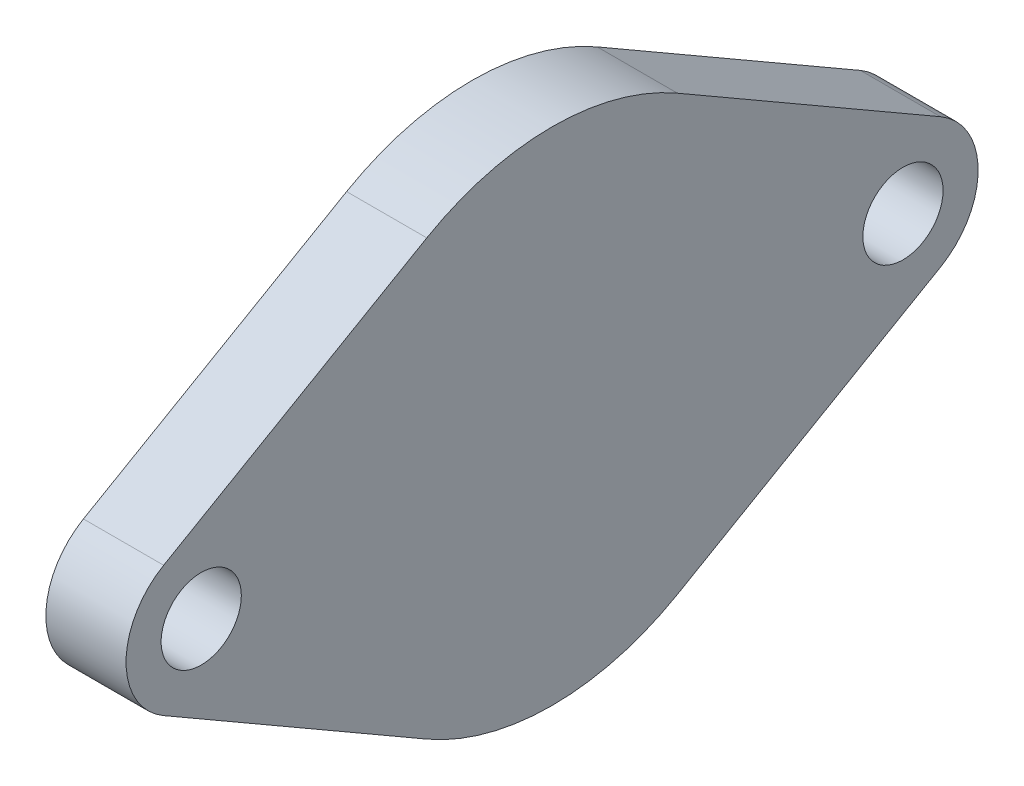
ISO-10303-21;
HEADER;
FILE_DESCRIPTION(('STEP AP214'),'2;1');
FILE_NAME('part.step','',(''),(''),'','','');
FILE_SCHEMA(('AUTOMOTIVE_DESIGN { 1 0 10303 214 1 1 1 1 }'));
ENDSEC;
DATA;
#1=APPLICATION_CONTEXT('core data for automotive mechanical design processes');
#2=APPLICATION_PROTOCOL_DEFINITION('international standard','automotive_design',2000,#1);
#3=PRODUCT_CONTEXT('',#1,'mechanical');
#4=PRODUCT('Part','Part','',(#3));
#5=PRODUCT_RELATED_PRODUCT_CATEGORY('part','',(#4));
#6=PRODUCT_DEFINITION_FORMATION('','',#4);
#7=PRODUCT_DEFINITION_CONTEXT('part definition',#1,'design');
#8=PRODUCT_DEFINITION('design','',#6,#7);
#9=PRODUCT_DEFINITION_SHAPE('','',#8);
#10=(LENGTH_UNIT() NAMED_UNIT(*) SI_UNIT(.MILLI.,.METRE.));
#11=(NAMED_UNIT(*) PLANE_ANGLE_UNIT() SI_UNIT($,.RADIAN.));
#12=(NAMED_UNIT(*) SI_UNIT($,.STERADIAN.) SOLID_ANGLE_UNIT());
#13=UNCERTAINTY_MEASURE_WITH_UNIT(LENGTH_MEASURE(1.E-05),#10,'distance_accuracy_value','');
#14=(GEOMETRIC_REPRESENTATION_CONTEXT(3) GLOBAL_UNCERTAINTY_ASSIGNED_CONTEXT((#13)) GLOBAL_UNIT_ASSIGNED_CONTEXT((#10,
#11,#12)) REPRESENTATION_CONTEXT('',''));
#15=CARTESIAN_POINT('',(0.,0.,0.));
#16=DIRECTION('',(0.,0.,1.));
#17=DIRECTION('',(1.,0.,0.));
#18=AXIS2_PLACEMENT_3D('',#15,#16,#17);
#19=CARTESIAN_POINT('',(4.,0.,0.));
#20=DIRECTION('',(1.,0.,0.));
#21=DIRECTION('',(0.,0.,-1.));
#22=AXIS2_PLACEMENT_3D('',#19,#20,#21);
#23=PLANE('',#22);
#24=DIRECTION('',(0.,0.500000000000001,-0.866025403784438));
#25=VECTOR('',#24,1.);
#26=CARTESIAN_POINT('',(4.,-21.650635094611,-12.5));
#27=LINE('',#26,#25);
#28=CARTESIAN_POINT('',(4.,-21.650635094611,-12.5));
#29=VERTEX_POINT('',#28);
#30=CARTESIAN_POINT('',(4.,-6.49519052838328,-38.75));
#31=VERTEX_POINT('',#30);
#32=EDGE_CURVE('E154',#29,#31,#27,.T.);
#33=ORIENTED_EDGE('',*,*,#32,.T.);
#34=CARTESIAN_POINT('',(4.,0.,-35.));
#35=DIRECTION('',(1.,0.,0.));
#36=DIRECTION('',(0.,0.,-1.));
#37=AXIS2_PLACEMENT_3D('',#34,#35,#36);
#38=CIRCLE('',#37,7.5);
#39=CARTESIAN_POINT('',(4.,6.4951905283833,-38.75));
#40=VERTEX_POINT('',#39);
#41=EDGE_CURVE('E162',#31,#40,#38,.T.);
#42=ORIENTED_EDGE('',*,*,#41,.T.);
#43=DIRECTION('',(0.,-0.5,-0.866025403784439));
#44=VECTOR('',#43,1.);
#45=CARTESIAN_POINT('',(4.,21.650635094611,-12.5));
#46=LINE('',#45,#44);
#47=CARTESIAN_POINT('',(4.,21.650635094611,-12.5));
#48=VERTEX_POINT('',#47);
#49=EDGE_CURVE('E168',#48,#40,#46,.T.);
#50=ORIENTED_EDGE('',*,*,#49,.F.);
#51=CARTESIAN_POINT('',(4.,0.,0.));
#52=DIRECTION('',(1.,0.,0.));
#53=DIRECTION('',(0.,0.,-1.));
#54=AXIS2_PLACEMENT_3D('',#51,#52,#53);
#55=CIRCLE('',#54,25.);
#56=CARTESIAN_POINT('',(4.,21.650635094611,12.5));
#57=VERTEX_POINT('',#56);
#58=EDGE_CURVE('E177',#48,#57,#55,.T.);
#59=ORIENTED_EDGE('',*,*,#58,.T.);
#60=DIRECTION('',(0.,0.5,-0.866025403784439));
#61=VECTOR('',#60,1.);
#62=CARTESIAN_POINT('',(4.,21.650635094611,12.5));
#63=LINE('',#62,#61);
#64=CARTESIAN_POINT('',(4.,6.49519052838329,38.75));
#65=VERTEX_POINT('',#64);
#66=EDGE_CURVE('E180',#65,#57,#63,.T.);
#67=ORIENTED_EDGE('',*,*,#66,.F.);
#68=CARTESIAN_POINT('',(4.,0.,35.));
#69=DIRECTION('',(1.,0.,0.));
#70=DIRECTION('',(0.,0.,-1.));
#71=AXIS2_PLACEMENT_3D('',#68,#69,#70);
#72=CIRCLE('',#71,7.5);
#73=CARTESIAN_POINT('',(4.,-6.49519052838329,38.75));
#74=VERTEX_POINT('',#73);
#75=EDGE_CURVE('E183',#65,#74,#72,.T.);
#76=ORIENTED_EDGE('',*,*,#75,.T.);
#77=DIRECTION('',(0.,0.5,0.866025403784439));
#78=VECTOR('',#77,1.);
#79=CARTESIAN_POINT('',(4.,-21.650635094611,12.5));
#80=LINE('',#79,#78);
#81=CARTESIAN_POINT('',(4.,-21.650635094611,12.5));
#82=VERTEX_POINT('',#81);
#83=EDGE_CURVE('E186',#82,#74,#80,.T.);
#84=ORIENTED_EDGE('',*,*,#83,.F.);
#85=CARTESIAN_POINT('',(4.,0.,0.));
#86=DIRECTION('',(1.,0.,0.));
#87=DIRECTION('',(0.,0.,-1.));
#88=AXIS2_PLACEMENT_3D('',#85,#86,#87);
#89=CIRCLE('',#88,25.);
#90=EDGE_CURVE('E173',#82,#29,#89,.T.);
#91=ORIENTED_EDGE('',*,*,#90,.T.);
#92=EDGE_LOOP('',(#33,#42,#50,#59,#67,#76,#84,#91));
#93=FACE_BOUND('',#92,.T.);
#94=CARTESIAN_POINT('',(4.,0.,35.));
#95=DIRECTION('',(1.,0.,0.));
#96=DIRECTION('',(0.,0.,-1.));
#97=AXIS2_PLACEMENT_3D('',#94,#95,#96);
#98=CIRCLE('',#97,4.);
#99=CARTESIAN_POINT('',(4.,0.,31.));
#100=VERTEX_POINT('',#99);
#101=EDGE_CURVE('E190',#100,#100,#98,.T.);
#102=ORIENTED_EDGE('',*,*,#101,.F.);
#103=EDGE_LOOP('',(#102));
#104=FACE_BOUND('',#103,.T.);
#105=CARTESIAN_POINT('',(4.,0.,-35.));
#106=DIRECTION('',(1.,0.,0.));
#107=DIRECTION('',(0.,0.,-1.));
#108=AXIS2_PLACEMENT_3D('',#105,#106,#107);
#109=CIRCLE('',#108,4.00000000000001);
#110=CARTESIAN_POINT('',(4.,0.,-39.));
#111=VERTEX_POINT('',#110);
#112=EDGE_CURVE('E193',#111,#111,#109,.T.);
#113=ORIENTED_EDGE('',*,*,#112,.F.);
#114=EDGE_LOOP('',(#113));
#115=FACE_BOUND('',#114,.T.);
#116=ADVANCED_FACE('F89',(#93,#104,#115),#23,.T.);
#117=CARTESIAN_POINT('',(-4.,-21.650635094611,-12.5));
#118=DIRECTION('',(0.,-0.866025403784438,-0.500000000000001));
#119=DIRECTION('',(0.,0.500000000000001,-0.866025403784438));
#120=AXIS2_PLACEMENT_3D('',#117,#118,#119);
#121=PLANE('',#120);
#122=DIRECTION('',(1.,0.,0.));
#123=VECTOR('',#122,1.);
#124=CARTESIAN_POINT('',(-4.,-6.49519052838328,-38.75));
#125=LINE('',#124,#123);
#126=CARTESIAN_POINT('',(-4.,-6.49519052838328,-38.75));
#127=VERTEX_POINT('',#126);
#128=EDGE_CURVE('E93',#127,#31,#125,.T.);
#129=ORIENTED_EDGE('',*,*,#128,.T.);
#130=ORIENTED_EDGE('',*,*,#32,.F.);
#131=DIRECTION('',(1.,0.,0.));
#132=VECTOR('',#131,1.);
#133=CARTESIAN_POINT('',(-4.,-21.650635094611,-12.5));
#134=LINE('',#133,#132);
#135=CARTESIAN_POINT('',(-4.,-21.650635094611,-12.5));
#136=VERTEX_POINT('',#135);
#137=EDGE_CURVE('E12',#136,#29,#134,.T.);
#138=ORIENTED_EDGE('',*,*,#137,.F.);
#139=DIRECTION('',(0.,0.500000000000001,-0.866025403784438));
#140=VECTOR('',#139,1.);
#141=CARTESIAN_POINT('',(-4.,-21.650635094611,-12.5));
#142=LINE('',#141,#140);
#143=EDGE_CURVE('E155',#136,#127,#142,.T.);
#144=ORIENTED_EDGE('',*,*,#143,.T.);
#145=EDGE_LOOP('',(#129,#130,#138,#144));
#146=FACE_BOUND('',#145,.T.);
#147=ADVANCED_FACE('F91',(#146),#121,.T.);
#148=CARTESIAN_POINT('',(-4.,0.,0.));
#149=DIRECTION('',(1.,0.,0.));
#150=DIRECTION('',(0.,0.,-1.));
#151=AXIS2_PLACEMENT_3D('',#148,#149,#150);
#152=CYLINDRICAL_SURFACE('',#151,25.);
#153=ORIENTED_EDGE('',*,*,#137,.T.);
#154=ORIENTED_EDGE('',*,*,#90,.F.);
#155=DIRECTION('',(1.,0.,0.));
#156=VECTOR('',#155,1.);
#157=CARTESIAN_POINT('',(-4.,-21.650635094611,12.5));
#158=LINE('',#157,#156);
#159=CARTESIAN_POINT('',(-4.,-21.650635094611,12.5));
#160=VERTEX_POINT('',#159);
#161=EDGE_CURVE('E98',#160,#82,#158,.T.);
#162=ORIENTED_EDGE('',*,*,#161,.F.);
#163=CARTESIAN_POINT('',(-4.,0.,0.));
#164=DIRECTION('',(1.,0.,0.));
#165=DIRECTION('',(0.,0.,-1.));
#166=AXIS2_PLACEMENT_3D('',#163,#164,#165);
#167=CIRCLE('',#166,25.);
#168=EDGE_CURVE('E211',#160,#136,#167,.T.);
#169=ORIENTED_EDGE('',*,*,#168,.T.);
#170=EDGE_LOOP('',(#153,#154,#162,#169));
#171=FACE_BOUND('',#170,.T.);
#172=ADVANCED_FACE('F246',(#171),#152,.T.);
#173=CARTESIAN_POINT('',(-4.,-21.650635094611,12.5));
#174=DIRECTION('',(0.,0.866025403784439,-0.5));
#175=DIRECTION('',(0.,0.5,0.866025403784439));
#176=AXIS2_PLACEMENT_3D('',#173,#174,#175);
#177=PLANE('',#176);
#178=ORIENTED_EDGE('',*,*,#161,.T.);
#179=ORIENTED_EDGE('',*,*,#83,.T.);
#180=DIRECTION('',(1.,0.,0.));
#181=VECTOR('',#180,1.);
#182=CARTESIAN_POINT('',(-4.,-6.49519052838329,38.75));
#183=LINE('',#182,#181);
#184=CARTESIAN_POINT('',(-4.,-6.49519052838329,38.75));
#185=VERTEX_POINT('',#184);
#186=EDGE_CURVE('E219',#185,#74,#183,.T.);
#187=ORIENTED_EDGE('',*,*,#186,.F.);
#188=DIRECTION('',(0.,0.5,0.866025403784439));
#189=VECTOR('',#188,1.);
#190=CARTESIAN_POINT('',(-4.,-21.650635094611,12.5));
#191=LINE('',#190,#189);
#192=EDGE_CURVE('E209',#160,#185,#191,.T.);
#193=ORIENTED_EDGE('',*,*,#192,.F.);
#194=EDGE_LOOP('',(#178,#179,#187,#193));
#195=FACE_BOUND('',#194,.T.);
#196=ADVANCED_FACE('F244',(#195),#177,.F.);
#197=CARTESIAN_POINT('',(-4.,0.,35.));
#198=DIRECTION('',(1.,0.,0.));
#199=DIRECTION('',(0.,0.,-1.));
#200=AXIS2_PLACEMENT_3D('',#197,#198,#199);
#201=CYLINDRICAL_SURFACE('',#200,7.5);
#202=ORIENTED_EDGE('',*,*,#186,.T.);
#203=ORIENTED_EDGE('',*,*,#75,.F.);
#204=DIRECTION('',(1.,0.,0.));
#205=VECTOR('',#204,1.);
#206=CARTESIAN_POINT('',(-4.,6.49519052838329,38.75));
#207=LINE('',#206,#205);
#208=CARTESIAN_POINT('',(-4.,6.49519052838329,38.75));
#209=VERTEX_POINT('',#208);
#210=EDGE_CURVE('E221',#209,#65,#207,.T.);
#211=ORIENTED_EDGE('',*,*,#210,.F.);
#212=CARTESIAN_POINT('',(-4.,0.,35.));
#213=DIRECTION('',(1.,0.,0.));
#214=DIRECTION('',(0.,0.,-1.));
#215=AXIS2_PLACEMENT_3D('',#212,#213,#214);
#216=CIRCLE('',#215,7.5);
#217=EDGE_CURVE('E206',#209,#185,#216,.T.);
#218=ORIENTED_EDGE('',*,*,#217,.T.);
#219=EDGE_LOOP('',(#202,#203,#211,#218));
#220=FACE_BOUND('',#219,.T.);
#221=ADVANCED_FACE('F241',(#220),#201,.T.);
#222=CARTESIAN_POINT('',(-4.,21.650635094611,12.5));
#223=DIRECTION('',(0.,-0.866025403784439,-0.5));
#224=DIRECTION('',(0.,0.5,-0.866025403784439));
#225=AXIS2_PLACEMENT_3D('',#222,#223,#224);
#226=PLANE('',#225);
#227=ORIENTED_EDGE('',*,*,#210,.T.);
#228=ORIENTED_EDGE('',*,*,#66,.T.);
#229=DIRECTION('',(1.,0.,0.));
#230=VECTOR('',#229,1.);
#231=CARTESIAN_POINT('',(-4.,21.650635094611,12.5));
#232=LINE('',#231,#230);
#233=CARTESIAN_POINT('',(-4.,21.650635094611,12.5));
#234=VERTEX_POINT('',#233);
#235=EDGE_CURVE('E223',#234,#57,#232,.T.);
#236=ORIENTED_EDGE('',*,*,#235,.F.);
#237=DIRECTION('',(0.,0.5,-0.866025403784439));
#238=VECTOR('',#237,1.);
#239=CARTESIAN_POINT('',(-4.,21.650635094611,12.5));
#240=LINE('',#239,#238);
#241=EDGE_CURVE('E204',#209,#234,#240,.T.);
#242=ORIENTED_EDGE('',*,*,#241,.F.);
#243=EDGE_LOOP('',(#227,#228,#236,#242));
#244=FACE_BOUND('',#243,.T.);
#245=ADVANCED_FACE('F236',(#244),#226,.F.);
#246=CARTESIAN_POINT('',(-4.,0.,0.));
#247=DIRECTION('',(1.,0.,0.));
#248=DIRECTION('',(0.,0.,-1.));
#249=AXIS2_PLACEMENT_3D('',#246,#247,#248);
#250=CYLINDRICAL_SURFACE('',#249,25.);
#251=ORIENTED_EDGE('',*,*,#235,.T.);
#252=ORIENTED_EDGE('',*,*,#58,.F.);
#253=DIRECTION('',(1.,0.,0.));
#254=VECTOR('',#253,1.);
#255=CARTESIAN_POINT('',(-4.,21.650635094611,-12.5));
#256=LINE('',#255,#254);
#257=CARTESIAN_POINT('',(-4.,21.650635094611,-12.5));
#258=VERTEX_POINT('',#257);
#259=EDGE_CURVE('E225',#258,#48,#256,.T.);
#260=ORIENTED_EDGE('',*,*,#259,.F.);
#261=CARTESIAN_POINT('',(-4.,0.,0.));
#262=DIRECTION('',(1.,0.,0.));
#263=DIRECTION('',(0.,0.,-1.));
#264=AXIS2_PLACEMENT_3D('',#261,#262,#263);
#265=CIRCLE('',#264,25.);
#266=EDGE_CURVE('E201',#258,#234,#265,.T.);
#267=ORIENTED_EDGE('',*,*,#266,.T.);
#268=EDGE_LOOP('',(#251,#252,#260,#267));
#269=FACE_BOUND('',#268,.T.);
#270=ADVANCED_FACE('F232',(#269),#250,.T.);
#271=CARTESIAN_POINT('',(-4.,21.650635094611,-12.5));
#272=DIRECTION('',(0.,-0.866025403784439,0.5));
#273=DIRECTION('',(0.,-0.5,-0.866025403784439));
#274=AXIS2_PLACEMENT_3D('',#271,#272,#273);
#275=PLANE('',#274);
#276=ORIENTED_EDGE('',*,*,#259,.T.);
#277=ORIENTED_EDGE('',*,*,#49,.T.);
#278=DIRECTION('',(1.,0.,0.));
#279=VECTOR('',#278,1.);
#280=CARTESIAN_POINT('',(-4.,6.4951905283833,-38.75));
#281=LINE('',#280,#279);
#282=CARTESIAN_POINT('',(-4.,6.4951905283833,-38.75));
#283=VERTEX_POINT('',#282);
#284=EDGE_CURVE('E159',#283,#40,#281,.T.);
#285=ORIENTED_EDGE('',*,*,#284,.F.);
#286=DIRECTION('',(0.,-0.5,-0.866025403784439));
#287=VECTOR('',#286,1.);
#288=CARTESIAN_POINT('',(-4.,21.650635094611,-12.5));
#289=LINE('',#288,#287);
#290=EDGE_CURVE('E199',#258,#283,#289,.T.);
#291=ORIENTED_EDGE('',*,*,#290,.F.);
#292=EDGE_LOOP('',(#276,#277,#285,#291));
#293=FACE_BOUND('',#292,.T.);
#294=ADVANCED_FACE('F229',(#293),#275,.F.);
#295=CARTESIAN_POINT('',(-4.,0.,35.));
#296=DIRECTION('',(1.,0.,0.));
#297=DIRECTION('',(0.,0.,-1.));
#298=AXIS2_PLACEMENT_3D('',#295,#296,#297);
#299=CYLINDRICAL_SURFACE('',#298,4.);
#300=CARTESIAN_POINT('',(-4.,0.,35.));
#301=DIRECTION('',(1.,0.,0.));
#302=DIRECTION('',(0.,0.,-1.));
#303=AXIS2_PLACEMENT_3D('',#300,#301,#302);
#304=CIRCLE('',#303,4.);
#305=CARTESIAN_POINT('',(-4.,0.,31.));
#306=VERTEX_POINT('',#305);
#307=EDGE_CURVE('E213',#306,#306,#304,.T.);
#308=ORIENTED_EDGE('',*,*,#307,.F.);
#309=EDGE_LOOP('',(#308));
#310=FACE_BOUND('',#309,.T.);
#311=ORIENTED_EDGE('',*,*,#101,.T.);
#312=EDGE_LOOP('',(#311));
#313=FACE_BOUND('',#312,.T.);
#314=ADVANCED_FACE('F268',(#310,#313),#299,.F.);
#315=CARTESIAN_POINT('',(-4.,0.,-35.));
#316=DIRECTION('',(1.,0.,0.));
#317=DIRECTION('',(0.,0.,-1.));
#318=AXIS2_PLACEMENT_3D('',#315,#316,#317);
#319=CYLINDRICAL_SURFACE('',#318,7.5);
#320=ORIENTED_EDGE('',*,*,#284,.T.);
#321=ORIENTED_EDGE('',*,*,#41,.F.);
#322=ORIENTED_EDGE('',*,*,#128,.F.);
#323=CARTESIAN_POINT('',(-4.,0.,-35.));
#324=DIRECTION('',(1.,0.,0.));
#325=DIRECTION('',(0.,0.,-1.));
#326=AXIS2_PLACEMENT_3D('',#323,#324,#325);
#327=CIRCLE('',#326,7.5);
#328=EDGE_CURVE('E197',#127,#283,#327,.T.);
#329=ORIENTED_EDGE('',*,*,#328,.T.);
#330=EDGE_LOOP('',(#320,#321,#322,#329));
#331=FACE_BOUND('',#330,.T.);
#332=ADVANCED_FACE('F163',(#331),#319,.T.);
#333=CARTESIAN_POINT('',(-4.,0.,-35.));
#334=DIRECTION('',(1.,0.,0.));
#335=DIRECTION('',(0.,0.,-1.));
#336=AXIS2_PLACEMENT_3D('',#333,#334,#335);
#337=CYLINDRICAL_SURFACE('',#336,4.00000000000001);
#338=CARTESIAN_POINT('',(-4.,0.,-35.));
#339=DIRECTION('',(1.,0.,0.));
#340=DIRECTION('',(0.,0.,-1.));
#341=AXIS2_PLACEMENT_3D('',#338,#339,#340);
#342=CIRCLE('',#341,4.00000000000001);
#343=CARTESIAN_POINT('',(-4.,0.,-39.));
#344=VERTEX_POINT('',#343);
#345=EDGE_CURVE('E160',#344,#344,#342,.T.);
#346=ORIENTED_EDGE('',*,*,#345,.F.);
#347=EDGE_LOOP('',(#346));
#348=FACE_BOUND('',#347,.T.);
#349=ORIENTED_EDGE('',*,*,#112,.T.);
#350=EDGE_LOOP('',(#349));
#351=FACE_BOUND('',#350,.T.);
#352=ADVANCED_FACE('F251',(#348,#351),#337,.F.);
#353=CARTESIAN_POINT('',(-4.,0.,0.));
#354=DIRECTION('',(1.,0.,0.));
#355=DIRECTION('',(0.,0.,-1.));
#356=AXIS2_PLACEMENT_3D('',#353,#354,#355);
#357=PLANE('',#356);
#358=ORIENTED_EDGE('',*,*,#143,.F.);
#359=ORIENTED_EDGE('',*,*,#168,.F.);
#360=ORIENTED_EDGE('',*,*,#192,.T.);
#361=ORIENTED_EDGE('',*,*,#217,.F.);
#362=ORIENTED_EDGE('',*,*,#241,.T.);
#363=ORIENTED_EDGE('',*,*,#266,.F.);
#364=ORIENTED_EDGE('',*,*,#290,.T.);
#365=ORIENTED_EDGE('',*,*,#328,.F.);
#366=EDGE_LOOP('',(#358,#359,#360,#361,#362,#363,#364,#365));
#367=FACE_BOUND('',#366,.T.);
#368=ORIENTED_EDGE('',*,*,#307,.T.);
#369=EDGE_LOOP('',(#368));
#370=FACE_BOUND('',#369,.T.);
#371=ORIENTED_EDGE('',*,*,#345,.T.);
#372=EDGE_LOOP('',(#371));
#373=FACE_BOUND('',#372,.T.);
#374=ADVANCED_FACE('F248',(#367,#370,#373),#357,.F.);
#375=CLOSED_SHELL('',(#116,#147,#172,#196,#221,#245,#270,#294,#314,#332,#352,#374));
#376=MANIFOLD_SOLID_BREP('B2',#375);
#377=ADVANCED_BREP_SHAPE_REPRESENTATION('',(#18,#376),#14);
#378=SHAPE_DEFINITION_REPRESENTATION(#9,#377);
ENDSEC;
END-ISO-10303-21;
